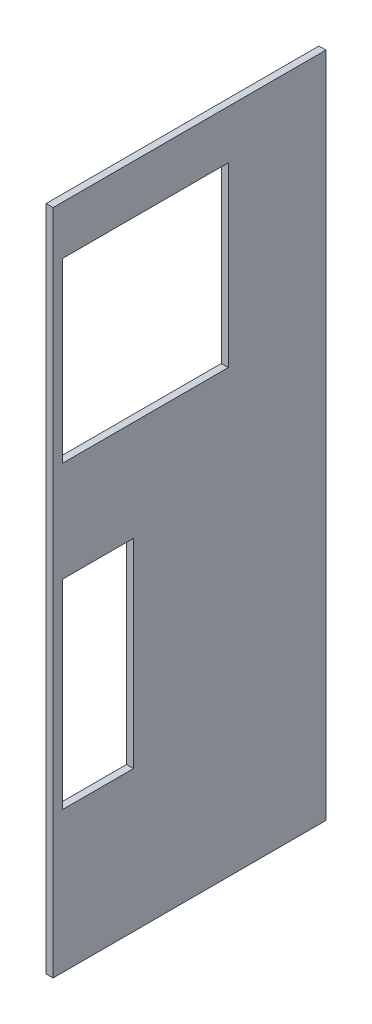
ISO-10303-21;
HEADER;
FILE_DESCRIPTION(('STEP AP214'),'2;1');
FILE_NAME('part.step','',(''),(''),'','','');
FILE_SCHEMA(('AUTOMOTIVE_DESIGN { 1 0 10303 214 1 1 1 1 }'));
ENDSEC;
DATA;
#1=APPLICATION_CONTEXT('core data for automotive mechanical design processes');
#2=APPLICATION_PROTOCOL_DEFINITION('international standard','automotive_design',2000,#1);
#3=PRODUCT_CONTEXT('',#1,'mechanical');
#4=PRODUCT('Part','Part','',(#3));
#5=PRODUCT_RELATED_PRODUCT_CATEGORY('part','',(#4));
#6=PRODUCT_DEFINITION_FORMATION('','',#4);
#7=PRODUCT_DEFINITION_CONTEXT('part definition',#1,'design');
#8=PRODUCT_DEFINITION('design','',#6,#7);
#9=PRODUCT_DEFINITION_SHAPE('','',#8);
#10=(LENGTH_UNIT() NAMED_UNIT(*) SI_UNIT(.MILLI.,.METRE.));
#11=(NAMED_UNIT(*) PLANE_ANGLE_UNIT() SI_UNIT($,.RADIAN.));
#12=(NAMED_UNIT(*) SI_UNIT($,.STERADIAN.) SOLID_ANGLE_UNIT());
#13=UNCERTAINTY_MEASURE_WITH_UNIT(LENGTH_MEASURE(1.E-05),#10,'distance_accuracy_value','');
#14=(GEOMETRIC_REPRESENTATION_CONTEXT(3) GLOBAL_UNCERTAINTY_ASSIGNED_CONTEXT((#13)) GLOBAL_UNIT_ASSIGNED_CONTEXT((#10,
#11,#12)) REPRESENTATION_CONTEXT('',''));
#15=CARTESIAN_POINT('',(0.,0.,0.));
#16=DIRECTION('',(0.,0.,1.));
#17=DIRECTION('',(1.,0.,0.));
#18=AXIS2_PLACEMENT_3D('',#15,#16,#17);
#19=CARTESIAN_POINT('',(1.5,5.85000000000011,3.40000000000003));
#20=DIRECTION('',(0.,-1.,0.));
#21=DIRECTION('',(0.,0.,-1.));
#22=AXIS2_PLACEMENT_3D('',#19,#20,#21);
#23=PLANE('',#22);
#24=DIRECTION('',(0.,0.,1.));
#25=VECTOR('',#24,1.);
#26=CARTESIAN_POINT('',(0.5,5.85000000000011,3.40000000000003));
#27=LINE('',#26,#25);
#28=CARTESIAN_POINT('',(0.5,5.85000000000011,3.40000000000003));
#29=VERTEX_POINT('',#28);
#30=CARTESIAN_POINT('',(0.5,5.85000000000012,42.25));
#31=VERTEX_POINT('',#30);
#32=EDGE_CURVE('E191',#29,#31,#27,.T.);
#33=ORIENTED_EDGE('',*,*,#32,.F.);
#34=DIRECTION('',(-1.,0.,0.));
#35=VECTOR('',#34,1.);
#36=CARTESIAN_POINT('',(1.5,5.85000000000011,3.40000000000003));
#37=LINE('',#36,#35);
#38=CARTESIAN_POINT('',(1.5,5.85000000000011,3.40000000000003));
#39=VERTEX_POINT('',#38);
#40=EDGE_CURVE('E11',#39,#29,#37,.T.);
#41=ORIENTED_EDGE('',*,*,#40,.F.);
#42=DIRECTION('',(0.,0.,1.));
#43=VECTOR('',#42,1.);
#44=CARTESIAN_POINT('',(1.5,5.85000000000011,3.40000000000003));
#45=LINE('',#44,#43);
#46=CARTESIAN_POINT('',(1.5,5.85000000000012,42.25));
#47=VERTEX_POINT('',#46);
#48=EDGE_CURVE('E192',#39,#47,#45,.T.);
#49=ORIENTED_EDGE('',*,*,#48,.T.);
#50=DIRECTION('',(-1.,0.,0.));
#51=VECTOR('',#50,1.);
#52=CARTESIAN_POINT('',(1.5,5.85000000000012,42.25));
#53=LINE('',#52,#51);
#54=EDGE_CURVE('E35',#47,#31,#53,.T.);
#55=ORIENTED_EDGE('',*,*,#54,.T.);
#56=EDGE_LOOP('',(#33,#41,#49,#55));
#57=FACE_BOUND('',#56,.T.);
#58=ADVANCED_FACE('F32',(#57),#23,.T.);
#59=CARTESIAN_POINT('',(1.5,100.85,3.40000000000002));
#60=DIRECTION('',(0.,0.,-1.));
#61=DIRECTION('',(0.,1.,0.));
#62=AXIS2_PLACEMENT_3D('',#59,#60,#61);
#63=PLANE('',#62);
#64=DIRECTION('',(0.,-1.,0.));
#65=VECTOR('',#64,1.);
#66=CARTESIAN_POINT('',(0.5,100.85,3.40000000000002));
#67=LINE('',#66,#65);
#68=CARTESIAN_POINT('',(0.5,100.85,3.40000000000002));
#69=VERTEX_POINT('',#68);
#70=EDGE_CURVE('E196',#69,#29,#67,.T.);
#71=ORIENTED_EDGE('',*,*,#70,.F.);
#72=DIRECTION('',(-1.,0.,0.));
#73=VECTOR('',#72,1.);
#74=CARTESIAN_POINT('',(1.5,100.85,3.40000000000002));
#75=LINE('',#74,#73);
#76=CARTESIAN_POINT('',(1.5,100.85,3.40000000000002));
#77=VERTEX_POINT('',#76);
#78=EDGE_CURVE('E40',#77,#69,#75,.T.);
#79=ORIENTED_EDGE('',*,*,#78,.F.);
#80=DIRECTION('',(0.,-1.,0.));
#81=VECTOR('',#80,1.);
#82=CARTESIAN_POINT('',(1.5,100.85,3.40000000000002));
#83=LINE('',#82,#81);
#84=EDGE_CURVE('E202',#77,#39,#83,.T.);
#85=ORIENTED_EDGE('',*,*,#84,.T.);
#86=ORIENTED_EDGE('',*,*,#40,.T.);
#87=EDGE_LOOP('',(#71,#79,#85,#86));
#88=FACE_BOUND('',#87,.T.);
#89=ADVANCED_FACE('F227',(#88),#63,.T.);
#90=CARTESIAN_POINT('',(1.5,100.85,42.25));
#91=DIRECTION('',(0.,1.,0.));
#92=DIRECTION('',(0.,0.,1.));
#93=AXIS2_PLACEMENT_3D('',#90,#91,#92);
#94=PLANE('',#93);
#95=DIRECTION('',(0.,0.,-1.));
#96=VECTOR('',#95,1.);
#97=CARTESIAN_POINT('',(0.5,100.85,42.25));
#98=LINE('',#97,#96);
#99=CARTESIAN_POINT('',(0.5,100.85,42.25));
#100=VERTEX_POINT('',#99);
#101=EDGE_CURVE('E210',#100,#69,#98,.T.);
#102=ORIENTED_EDGE('',*,*,#101,.F.);
#103=DIRECTION('',(-1.,0.,0.));
#104=VECTOR('',#103,1.);
#105=CARTESIAN_POINT('',(1.5,100.85,42.25));
#106=LINE('',#105,#104);
#107=CARTESIAN_POINT('',(1.5,100.85,42.25));
#108=VERTEX_POINT('',#107);
#109=EDGE_CURVE('E215',#108,#100,#106,.T.);
#110=ORIENTED_EDGE('',*,*,#109,.F.);
#111=DIRECTION('',(0.,0.,-1.));
#112=VECTOR('',#111,1.);
#113=CARTESIAN_POINT('',(1.5,100.85,42.25));
#114=LINE('',#113,#112);
#115=EDGE_CURVE('E199',#108,#77,#114,.T.);
#116=ORIENTED_EDGE('',*,*,#115,.T.);
#117=ORIENTED_EDGE('',*,*,#78,.T.);
#118=EDGE_LOOP('',(#102,#110,#116,#117));
#119=FACE_BOUND('',#118,.T.);
#120=ADVANCED_FACE('F233',(#119),#94,.T.);
#121=CARTESIAN_POINT('',(1.5,5.85000000000012,42.25));
#122=DIRECTION('',(0.,0.,1.));
#123=DIRECTION('',(0.,-1.,0.));
#124=AXIS2_PLACEMENT_3D('',#121,#122,#123);
#125=PLANE('',#124);
#126=DIRECTION('',(0.,1.,0.));
#127=VECTOR('',#126,1.);
#128=CARTESIAN_POINT('',(0.5,5.85000000000012,42.25));
#129=LINE('',#128,#127);
#130=EDGE_CURVE('E207',#31,#100,#129,.T.);
#131=ORIENTED_EDGE('',*,*,#130,.F.);
#132=ORIENTED_EDGE('',*,*,#54,.F.);
#133=DIRECTION('',(0.,1.,0.));
#134=VECTOR('',#133,1.);
#135=CARTESIAN_POINT('',(1.5,5.85000000000012,42.25));
#136=LINE('',#135,#134);
#137=EDGE_CURVE('E195',#47,#108,#136,.T.);
#138=ORIENTED_EDGE('',*,*,#137,.T.);
#139=ORIENTED_EDGE('',*,*,#109,.T.);
#140=EDGE_LOOP('',(#131,#132,#138,#139));
#141=FACE_BOUND('',#140,.T.);
#142=ADVANCED_FACE('F223',(#141),#125,.T.);
#143=CARTESIAN_POINT('',(1.5,0.,0.));
#144=DIRECTION('',(-1.,0.,0.));
#145=DIRECTION('',(0.,0.,1.));
#146=AXIS2_PLACEMENT_3D('',#143,#144,#145);
#147=PLANE('',#146);
#148=DIRECTION('',(0.,0.,1.));
#149=VECTOR('',#148,1.);
#150=CARTESIAN_POINT('',(1.5,25.95,0.));
#151=LINE('',#150,#149);
#152=CARTESIAN_POINT('',(1.5,25.95,30.8));
#153=VERTEX_POINT('',#152);
#154=CARTESIAN_POINT('',(1.5,25.95,40.9));
#155=VERTEX_POINT('',#154);
#156=EDGE_CURVE('E185',#153,#155,#151,.T.);
#157=ORIENTED_EDGE('',*,*,#156,.T.);
#158=DIRECTION('',(0.,1.,0.));
#159=VECTOR('',#158,1.);
#160=CARTESIAN_POINT('',(1.5,0.,40.9));
#161=LINE('',#160,#159);
#162=CARTESIAN_POINT('',(1.5,54.35,40.9));
#163=VERTEX_POINT('',#162);
#164=EDGE_CURVE('E188',#155,#163,#161,.T.);
#165=ORIENTED_EDGE('',*,*,#164,.T.);
#166=DIRECTION('',(0.,0.,-1.));
#167=VECTOR('',#166,1.);
#168=CARTESIAN_POINT('',(1.5,54.35,0.));
#169=LINE('',#168,#167);
#170=CARTESIAN_POINT('',(1.5,54.35,30.8));
#171=VERTEX_POINT('',#170);
#172=EDGE_CURVE('E182',#163,#171,#169,.T.);
#173=ORIENTED_EDGE('',*,*,#172,.T.);
#174=DIRECTION('',(0.,-1.,0.));
#175=VECTOR('',#174,1.);
#176=CARTESIAN_POINT('',(1.5,0.,30.8));
#177=LINE('',#176,#175);
#178=EDGE_CURVE('E126',#171,#153,#177,.T.);
#179=ORIENTED_EDGE('',*,*,#178,.T.);
#180=EDGE_LOOP('',(#157,#165,#173,#179));
#181=FACE_BOUND('',#180,.T.);
#182=DIRECTION('',(0.,0.,-1.));
#183=VECTOR('',#182,1.);
#184=CARTESIAN_POINT('',(1.5,93.9,0.));
#185=LINE('',#184,#183);
#186=CARTESIAN_POINT('',(1.5,93.9,40.9));
#187=VERTEX_POINT('',#186);
#188=CARTESIAN_POINT('',(1.5,93.9,17.3));
#189=VERTEX_POINT('',#188);
#190=EDGE_CURVE('E176',#187,#189,#185,.T.);
#191=ORIENTED_EDGE('',*,*,#190,.T.);
#192=DIRECTION('',(0.,-1.,0.));
#193=VECTOR('',#192,1.);
#194=CARTESIAN_POINT('',(1.5,0.,17.3));
#195=LINE('',#194,#193);
#196=CARTESIAN_POINT('',(1.5,68.65,17.3));
#197=VERTEX_POINT('',#196);
#198=EDGE_CURVE('E179',#189,#197,#195,.T.);
#199=ORIENTED_EDGE('',*,*,#198,.T.);
#200=DIRECTION('',(0.,0.,1.));
#201=VECTOR('',#200,1.);
#202=CARTESIAN_POINT('',(1.5,68.65,0.));
#203=LINE('',#202,#201);
#204=CARTESIAN_POINT('',(1.5,68.65,40.9));
#205=VERTEX_POINT('',#204);
#206=EDGE_CURVE('E150',#197,#205,#203,.T.);
#207=ORIENTED_EDGE('',*,*,#206,.T.);
#208=DIRECTION('',(0.,1.,0.));
#209=VECTOR('',#208,1.);
#210=CARTESIAN_POINT('',(1.5,0.,40.9));
#211=LINE('',#210,#209);
#212=EDGE_CURVE('E173',#205,#187,#211,.T.);
#213=ORIENTED_EDGE('',*,*,#212,.T.);
#214=EDGE_LOOP('',(#191,#199,#207,#213));
#215=FACE_BOUND('',#214,.T.);
#216=ORIENTED_EDGE('',*,*,#48,.F.);
#217=ORIENTED_EDGE('',*,*,#84,.F.);
#218=ORIENTED_EDGE('',*,*,#115,.F.);
#219=ORIENTED_EDGE('',*,*,#137,.F.);
#220=EDGE_LOOP('',(#216,#217,#218,#219));
#221=FACE_BOUND('',#220,.T.);
#222=ADVANCED_FACE('F230',(#181,#215,#221),#147,.F.);
#223=CARTESIAN_POINT('',(0.5,0.,0.));
#224=DIRECTION('',(-1.,0.,0.));
#225=DIRECTION('',(0.,0.,1.));
#226=AXIS2_PLACEMENT_3D('',#223,#224,#225);
#227=PLANE('',#226);
#228=DIRECTION('',(0.,1.,0.));
#229=VECTOR('',#228,1.);
#230=CARTESIAN_POINT('',(0.5,25.95,40.9));
#231=LINE('',#230,#229);
#232=CARTESIAN_POINT('',(0.5,25.95,40.9));
#233=VERTEX_POINT('',#232);
#234=CARTESIAN_POINT('',(0.5,54.35,40.9));
#235=VERTEX_POINT('',#234);
#236=EDGE_CURVE('E138',#233,#235,#231,.T.);
#237=ORIENTED_EDGE('',*,*,#236,.F.);
#238=DIRECTION('',(0.,0.,1.));
#239=VECTOR('',#238,1.);
#240=CARTESIAN_POINT('',(0.5,25.95,40.9));
#241=LINE('',#240,#239);
#242=CARTESIAN_POINT('',(0.5,25.95,30.8));
#243=VERTEX_POINT('',#242);
#244=EDGE_CURVE('E143',#243,#233,#241,.T.);
#245=ORIENTED_EDGE('',*,*,#244,.F.);
#246=DIRECTION('',(0.,-1.,0.));
#247=VECTOR('',#246,1.);
#248=CARTESIAN_POINT('',(0.5,25.95,30.8));
#249=LINE('',#248,#247);
#250=CARTESIAN_POINT('',(0.5,54.35,30.8));
#251=VERTEX_POINT('',#250);
#252=EDGE_CURVE('E123',#251,#243,#249,.T.);
#253=ORIENTED_EDGE('',*,*,#252,.F.);
#254=DIRECTION('',(0.,0.,-1.));
#255=VECTOR('',#254,1.);
#256=CARTESIAN_POINT('',(0.5,54.35,40.9));
#257=LINE('',#256,#255);
#258=EDGE_CURVE('E133',#235,#251,#257,.T.);
#259=ORIENTED_EDGE('',*,*,#258,.F.);
#260=EDGE_LOOP('',(#237,#245,#253,#259));
#261=FACE_BOUND('',#260,.T.);
#262=DIRECTION('',(0.,-1.,0.));
#263=VECTOR('',#262,1.);
#264=CARTESIAN_POINT('',(0.5,68.65,17.3));
#265=LINE('',#264,#263);
#266=CARTESIAN_POINT('',(0.5,93.9,17.3));
#267=VERTEX_POINT('',#266);
#268=CARTESIAN_POINT('',(0.5,68.65,17.3));
#269=VERTEX_POINT('',#268);
#270=EDGE_CURVE('E153',#267,#269,#265,.T.);
#271=ORIENTED_EDGE('',*,*,#270,.F.);
#272=DIRECTION('',(0.,0.,-1.));
#273=VECTOR('',#272,1.);
#274=CARTESIAN_POINT('',(0.5,93.9,17.3));
#275=LINE('',#274,#273);
#276=CARTESIAN_POINT('',(0.5,93.9,40.9));
#277=VERTEX_POINT('',#276);
#278=EDGE_CURVE('E160',#277,#267,#275,.T.);
#279=ORIENTED_EDGE('',*,*,#278,.F.);
#280=DIRECTION('',(0.,1.,0.));
#281=VECTOR('',#280,1.);
#282=CARTESIAN_POINT('',(0.5,68.65,40.9));
#283=LINE('',#282,#281);
#284=CARTESIAN_POINT('',(0.5,68.65,40.9));
#285=VERTEX_POINT('',#284);
#286=EDGE_CURVE('E157',#285,#277,#283,.T.);
#287=ORIENTED_EDGE('',*,*,#286,.F.);
#288=DIRECTION('',(0.,0.,1.));
#289=VECTOR('',#288,1.);
#290=CARTESIAN_POINT('',(0.5,68.65,17.3));
#291=LINE('',#290,#289);
#292=EDGE_CURVE('E155',#269,#285,#291,.T.);
#293=ORIENTED_EDGE('',*,*,#292,.F.);
#294=EDGE_LOOP('',(#271,#279,#287,#293));
#295=FACE_BOUND('',#294,.T.);
#296=ORIENTED_EDGE('',*,*,#32,.T.);
#297=ORIENTED_EDGE('',*,*,#130,.T.);
#298=ORIENTED_EDGE('',*,*,#101,.T.);
#299=ORIENTED_EDGE('',*,*,#70,.T.);
#300=EDGE_LOOP('',(#296,#297,#298,#299));
#301=FACE_BOUND('',#300,.T.);
#302=ADVANCED_FACE('F140',(#261,#295,#301),#227,.T.);
#303=CARTESIAN_POINT('',(10.5,68.65,17.3));
#304=DIRECTION('',(0.,0.,-1.));
#305=DIRECTION('',(-1.,0.,0.));
#306=AXIS2_PLACEMENT_3D('',#303,#304,#305);
#307=PLANE('',#306);
#308=DIRECTION('',(-1.,0.,0.));
#309=VECTOR('',#308,1.);
#310=CARTESIAN_POINT('',(10.5,93.9,17.3));
#311=LINE('',#310,#309);
#312=EDGE_CURVE('E164',#189,#267,#311,.T.);
#313=ORIENTED_EDGE('',*,*,#312,.T.);
#314=ORIENTED_EDGE('',*,*,#270,.T.);
#315=DIRECTION('',(-1.,0.,0.));
#316=VECTOR('',#315,1.);
#317=CARTESIAN_POINT('',(10.5,68.65,17.3));
#318=LINE('',#317,#316);
#319=EDGE_CURVE('E163',#197,#269,#318,.T.);
#320=ORIENTED_EDGE('',*,*,#319,.F.);
#321=ORIENTED_EDGE('',*,*,#198,.F.);
#322=EDGE_LOOP('',(#313,#314,#320,#321));
#323=FACE_BOUND('',#322,.T.);
#324=ADVANCED_FACE('F276',(#323),#307,.F.);
#325=CARTESIAN_POINT('',(10.5,93.9,17.3));
#326=DIRECTION('',(0.,1.,0.));
#327=DIRECTION('',(0.,0.,1.));
#328=AXIS2_PLACEMENT_3D('',#325,#326,#327);
#329=PLANE('',#328);
#330=DIRECTION('',(-1.,0.,0.));
#331=VECTOR('',#330,1.);
#332=CARTESIAN_POINT('',(10.5,93.9,40.9));
#333=LINE('',#332,#331);
#334=EDGE_CURVE('E166',#187,#277,#333,.T.);
#335=ORIENTED_EDGE('',*,*,#334,.T.);
#336=ORIENTED_EDGE('',*,*,#278,.T.);
#337=ORIENTED_EDGE('',*,*,#312,.F.);
#338=ORIENTED_EDGE('',*,*,#190,.F.);
#339=EDGE_LOOP('',(#335,#336,#337,#338));
#340=FACE_BOUND('',#339,.T.);
#341=ADVANCED_FACE('F285',(#340),#329,.F.);
#342=CARTESIAN_POINT('',(10.5,68.65,40.9));
#343=DIRECTION('',(0.,0.,1.));
#344=DIRECTION('',(1.,0.,0.));
#345=AXIS2_PLACEMENT_3D('',#342,#343,#344);
#346=PLANE('',#345);
#347=DIRECTION('',(-1.,0.,0.));
#348=VECTOR('',#347,1.);
#349=CARTESIAN_POINT('',(10.5,68.65,40.9));
#350=LINE('',#349,#348);
#351=EDGE_CURVE('E56',#205,#285,#350,.T.);
#352=ORIENTED_EDGE('',*,*,#351,.T.);
#353=ORIENTED_EDGE('',*,*,#286,.T.);
#354=ORIENTED_EDGE('',*,*,#334,.F.);
#355=ORIENTED_EDGE('',*,*,#212,.F.);
#356=EDGE_LOOP('',(#352,#353,#354,#355));
#357=FACE_BOUND('',#356,.T.);
#358=ADVANCED_FACE('F295',(#357),#346,.F.);
#359=CARTESIAN_POINT('',(10.5,68.65,17.3));
#360=DIRECTION('',(0.,-1.,0.));
#361=DIRECTION('',(0.,0.,-1.));
#362=AXIS2_PLACEMENT_3D('',#359,#360,#361);
#363=PLANE('',#362);
#364=ORIENTED_EDGE('',*,*,#319,.T.);
#365=ORIENTED_EDGE('',*,*,#292,.T.);
#366=ORIENTED_EDGE('',*,*,#351,.F.);
#367=ORIENTED_EDGE('',*,*,#206,.F.);
#368=EDGE_LOOP('',(#364,#365,#366,#367));
#369=FACE_BOUND('',#368,.T.);
#370=ADVANCED_FACE('F305',(#369),#363,.F.);
#371=CARTESIAN_POINT('',(10.5,25.95,40.9));
#372=DIRECTION('',(0.,0.,1.));
#373=DIRECTION('',(1.,0.,0.));
#374=AXIS2_PLACEMENT_3D('',#371,#372,#373);
#375=PLANE('',#374);
#376=DIRECTION('',(-1.,0.,0.));
#377=VECTOR('',#376,1.);
#378=CARTESIAN_POINT('',(10.5,25.95,40.9));
#379=LINE('',#378,#377);
#380=EDGE_CURVE('E148',#155,#233,#379,.T.);
#381=ORIENTED_EDGE('',*,*,#380,.T.);
#382=ORIENTED_EDGE('',*,*,#236,.T.);
#383=DIRECTION('',(-1.,0.,0.));
#384=VECTOR('',#383,1.);
#385=CARTESIAN_POINT('',(10.5,54.35,40.9));
#386=LINE('',#385,#384);
#387=EDGE_CURVE('E129',#163,#235,#386,.T.);
#388=ORIENTED_EDGE('',*,*,#387,.F.);
#389=ORIENTED_EDGE('',*,*,#164,.F.);
#390=EDGE_LOOP('',(#381,#382,#388,#389));
#391=FACE_BOUND('',#390,.T.);
#392=ADVANCED_FACE('F315',(#391),#375,.F.);
#393=CARTESIAN_POINT('',(10.5,25.95,40.9));
#394=DIRECTION('',(0.,-1.,0.));
#395=DIRECTION('',(0.,0.,-1.));
#396=AXIS2_PLACEMENT_3D('',#393,#394,#395);
#397=PLANE('',#396);
#398=DIRECTION('',(-1.,0.,0.));
#399=VECTOR('',#398,1.);
#400=CARTESIAN_POINT('',(10.5,25.95,30.8));
#401=LINE('',#400,#399);
#402=EDGE_CURVE('E128',#153,#243,#401,.T.);
#403=ORIENTED_EDGE('',*,*,#402,.T.);
#404=ORIENTED_EDGE('',*,*,#244,.T.);
#405=ORIENTED_EDGE('',*,*,#380,.F.);
#406=ORIENTED_EDGE('',*,*,#156,.F.);
#407=EDGE_LOOP('',(#403,#404,#405,#406));
#408=FACE_BOUND('',#407,.T.);
#409=ADVANCED_FACE('F324',(#408),#397,.F.);
#410=CARTESIAN_POINT('',(10.5,25.95,30.8));
#411=DIRECTION('',(0.,0.,-1.));
#412=DIRECTION('',(-1.,0.,0.));
#413=AXIS2_PLACEMENT_3D('',#410,#411,#412);
#414=PLANE('',#413);
#415=DIRECTION('',(-1.,0.,0.));
#416=VECTOR('',#415,1.);
#417=CARTESIAN_POINT('',(10.5,54.35,30.8));
#418=LINE('',#417,#416);
#419=EDGE_CURVE('E48',#171,#251,#418,.T.);
#420=ORIENTED_EDGE('',*,*,#419,.T.);
#421=ORIENTED_EDGE('',*,*,#252,.T.);
#422=ORIENTED_EDGE('',*,*,#402,.F.);
#423=ORIENTED_EDGE('',*,*,#178,.F.);
#424=EDGE_LOOP('',(#420,#421,#422,#423));
#425=FACE_BOUND('',#424,.T.);
#426=ADVANCED_FACE('F120',(#425),#414,.F.);
#427=CARTESIAN_POINT('',(10.5,54.35,40.9));
#428=DIRECTION('',(0.,1.,0.));
#429=DIRECTION('',(0.,0.,1.));
#430=AXIS2_PLACEMENT_3D('',#427,#428,#429);
#431=PLANE('',#430);
#432=ORIENTED_EDGE('',*,*,#387,.T.);
#433=ORIENTED_EDGE('',*,*,#258,.T.);
#434=ORIENTED_EDGE('',*,*,#419,.F.);
#435=ORIENTED_EDGE('',*,*,#172,.F.);
#436=EDGE_LOOP('',(#432,#433,#434,#435));
#437=FACE_BOUND('',#436,.T.);
#438=ADVANCED_FACE('F134',(#437),#431,.F.);
#439=CLOSED_SHELL('',(#58,#89,#120,#142,#222,#302,#324,#341,#358,#370,#392,#409,#426,#438));
#440=MANIFOLD_SOLID_BREP('B2',#439);
#441=ADVANCED_BREP_SHAPE_REPRESENTATION('',(#18,#440),#14);
#442=SHAPE_DEFINITION_REPRESENTATION(#9,#441);
ENDSEC;
END-ISO-10303-21;
